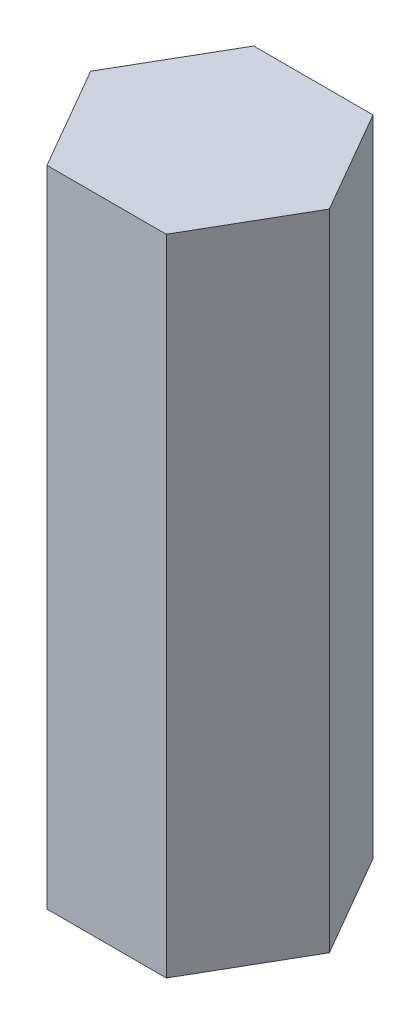
ISO-10303-21;
HEADER;
FILE_DESCRIPTION(('STEP AP214'),'2;1');
FILE_NAME('part.step','',(''),(''),'','','');
FILE_SCHEMA(('AUTOMOTIVE_DESIGN { 1 0 10303 214 1 1 1 1 }'));
ENDSEC;
DATA;
#1=APPLICATION_CONTEXT('core data for automotive mechanical design processes');
#2=APPLICATION_PROTOCOL_DEFINITION('international standard','automotive_design',2000,#1);
#3=PRODUCT_CONTEXT('',#1,'mechanical');
#4=PRODUCT('Part','Part','',(#3));
#5=PRODUCT_RELATED_PRODUCT_CATEGORY('part','',(#4));
#6=PRODUCT_DEFINITION_FORMATION('','',#4);
#7=PRODUCT_DEFINITION_CONTEXT('part definition',#1,'design');
#8=PRODUCT_DEFINITION('design','',#6,#7);
#9=PRODUCT_DEFINITION_SHAPE('','',#8);
#10=(LENGTH_UNIT() NAMED_UNIT(*) SI_UNIT(.MILLI.,.METRE.));
#11=(NAMED_UNIT(*) PLANE_ANGLE_UNIT() SI_UNIT($,.RADIAN.));
#12=(NAMED_UNIT(*) SI_UNIT($,.STERADIAN.) SOLID_ANGLE_UNIT());
#13=UNCERTAINTY_MEASURE_WITH_UNIT(LENGTH_MEASURE(1.E-05),#10,'distance_accuracy_value','');
#14=(GEOMETRIC_REPRESENTATION_CONTEXT(3) GLOBAL_UNCERTAINTY_ASSIGNED_CONTEXT((#13)) GLOBAL_UNIT_ASSIGNED_CONTEXT((#10,
#11,#12)) REPRESENTATION_CONTEXT('',''));
#15=CARTESIAN_POINT('',(0.,0.,0.));
#16=DIRECTION('',(0.,0.,1.));
#17=DIRECTION('',(1.,0.,0.));
#18=AXIS2_PLACEMENT_3D('',#15,#16,#17);
#19=CARTESIAN_POINT('',(1.5,16.19,2.59807621135332));
#20=DIRECTION('',(-0.866025403784439,0.,-0.5));
#21=DIRECTION('',(-0.5,0.,0.866025403784439));
#22=AXIS2_PLACEMENT_3D('',#19,#20,#21);
#23=PLANE('',#22);
#24=DIRECTION('',(0.5,0.,-0.866025403784439));
#25=VECTOR('',#24,1.);
#26=CARTESIAN_POINT('',(1.5,0.,2.59807621135332));
#27=LINE('',#26,#25);
#28=CARTESIAN_POINT('',(1.5,0.,2.59807621135332));
#29=VERTEX_POINT('',#28);
#30=CARTESIAN_POINT('',(3.,0.,0.));
#31=VERTEX_POINT('',#30);
#32=EDGE_CURVE('E116',#29,#31,#27,.T.);
#33=ORIENTED_EDGE('',*,*,#32,.T.);
#34=DIRECTION('',(0.,-1.,0.));
#35=VECTOR('',#34,1.);
#36=CARTESIAN_POINT('',(3.,16.19,0.));
#37=LINE('',#36,#35);
#38=CARTESIAN_POINT('',(3.,16.19,0.));
#39=VERTEX_POINT('',#38);
#40=EDGE_CURVE('E11',#39,#31,#37,.T.);
#41=ORIENTED_EDGE('',*,*,#40,.F.);
#42=DIRECTION('',(0.5,0.,-0.866025403784439));
#43=VECTOR('',#42,1.);
#44=CARTESIAN_POINT('',(1.5,16.19,2.59807621135332));
#45=LINE('',#44,#43);
#46=CARTESIAN_POINT('',(1.5,16.19,2.59807621135332));
#47=VERTEX_POINT('',#46);
#48=EDGE_CURVE('E127',#47,#39,#45,.T.);
#49=ORIENTED_EDGE('',*,*,#48,.F.);
#50=DIRECTION('',(0.,-1.,0.));
#51=VECTOR('',#50,1.);
#52=CARTESIAN_POINT('',(1.5,16.19,2.59807621135332));
#53=LINE('',#52,#51);
#54=EDGE_CURVE('E112',#47,#29,#53,.T.);
#55=ORIENTED_EDGE('',*,*,#54,.T.);
#56=EDGE_LOOP('',(#33,#41,#49,#55));
#57=FACE_BOUND('',#56,.T.);
#58=ADVANCED_FACE('F32',(#57),#23,.F.);
#59=CARTESIAN_POINT('',(3.,16.19,0.));
#60=DIRECTION('',(-0.866025403784439,0.,0.5));
#61=DIRECTION('',(0.5,0.,0.866025403784439));
#62=AXIS2_PLACEMENT_3D('',#59,#60,#61);
#63=PLANE('',#62);
#64=DIRECTION('',(-0.5,0.,-0.866025403784439));
#65=VECTOR('',#64,1.);
#66=CARTESIAN_POINT('',(3.,0.,0.));
#67=LINE('',#66,#65);
#68=CARTESIAN_POINT('',(1.5,0.,-2.59807621135332));
#69=VERTEX_POINT('',#68);
#70=EDGE_CURVE('E119',#31,#69,#67,.T.);
#71=ORIENTED_EDGE('',*,*,#70,.T.);
#72=DIRECTION('',(0.,-1.,0.));
#73=VECTOR('',#72,1.);
#74=CARTESIAN_POINT('',(1.5,16.19,-2.59807621135332));
#75=LINE('',#74,#73);
#76=CARTESIAN_POINT('',(1.5,16.19,-2.59807621135332));
#77=VERTEX_POINT('',#76);
#78=EDGE_CURVE('E40',#77,#69,#75,.T.);
#79=ORIENTED_EDGE('',*,*,#78,.F.);
#80=DIRECTION('',(-0.5,0.,-0.866025403784439));
#81=VECTOR('',#80,1.);
#82=CARTESIAN_POINT('',(3.,16.19,0.));
#83=LINE('',#82,#81);
#84=EDGE_CURVE('E85',#39,#77,#83,.T.);
#85=ORIENTED_EDGE('',*,*,#84,.F.);
#86=ORIENTED_EDGE('',*,*,#40,.T.);
#87=EDGE_LOOP('',(#71,#79,#85,#86));
#88=FACE_BOUND('',#87,.T.);
#89=ADVANCED_FACE('F151',(#88),#63,.F.);
#90=CARTESIAN_POINT('',(1.5,16.19,-2.59807621135332));
#91=DIRECTION('',(0.,0.,1.));
#92=DIRECTION('',(1.,0.,0.));
#93=AXIS2_PLACEMENT_3D('',#90,#91,#92);
#94=PLANE('',#93);
#95=DIRECTION('',(-1.,0.,0.));
#96=VECTOR('',#95,1.);
#97=CARTESIAN_POINT('',(1.5,0.,-2.59807621135332));
#98=LINE('',#97,#96);
#99=CARTESIAN_POINT('',(-1.5,0.,-2.59807621135332));
#100=VERTEX_POINT('',#99);
#101=EDGE_CURVE('E122',#69,#100,#98,.T.);
#102=ORIENTED_EDGE('',*,*,#101,.T.);
#103=DIRECTION('',(0.,-1.,0.));
#104=VECTOR('',#103,1.);
#105=CARTESIAN_POINT('',(-1.5,16.19,-2.59807621135332));
#106=LINE('',#105,#104);
#107=CARTESIAN_POINT('',(-1.5,16.19,-2.59807621135332));
#108=VERTEX_POINT('',#107);
#109=EDGE_CURVE('E107',#108,#100,#106,.T.);
#110=ORIENTED_EDGE('',*,*,#109,.F.);
#111=DIRECTION('',(-1.,0.,0.));
#112=VECTOR('',#111,1.);
#113=CARTESIAN_POINT('',(1.5,16.19,-2.59807621135332));
#114=LINE('',#113,#112);
#115=EDGE_CURVE('E98',#77,#108,#114,.T.);
#116=ORIENTED_EDGE('',*,*,#115,.F.);
#117=ORIENTED_EDGE('',*,*,#78,.T.);
#118=EDGE_LOOP('',(#102,#110,#116,#117));
#119=FACE_BOUND('',#118,.T.);
#120=ADVANCED_FACE('F133',(#119),#94,.F.);
#121=CARTESIAN_POINT('',(-1.5,16.19,-2.59807621135332));
#122=DIRECTION('',(0.866025403784439,0.,0.5));
#123=DIRECTION('',(0.5,0.,-0.866025403784439));
#124=AXIS2_PLACEMENT_3D('',#121,#122,#123);
#125=PLANE('',#124);
#126=DIRECTION('',(-0.5,0.,0.866025403784439));
#127=VECTOR('',#126,1.);
#128=CARTESIAN_POINT('',(-1.5,0.,-2.59807621135332));
#129=LINE('',#128,#127);
#130=CARTESIAN_POINT('',(-3.,0.,0.));
#131=VERTEX_POINT('',#130);
#132=EDGE_CURVE('E106',#100,#131,#129,.T.);
#133=ORIENTED_EDGE('',*,*,#132,.T.);
#134=DIRECTION('',(0.,-1.,0.));
#135=VECTOR('',#134,1.);
#136=CARTESIAN_POINT('',(-3.,16.19,0.));
#137=LINE('',#136,#135);
#138=CARTESIAN_POINT('',(-3.,16.19,0.));
#139=VERTEX_POINT('',#138);
#140=EDGE_CURVE('E103',#139,#131,#137,.T.);
#141=ORIENTED_EDGE('',*,*,#140,.F.);
#142=DIRECTION('',(-0.5,0.,0.866025403784439));
#143=VECTOR('',#142,1.);
#144=CARTESIAN_POINT('',(-1.5,16.19,-2.59807621135332));
#145=LINE('',#144,#143);
#146=EDGE_CURVE('E92',#108,#139,#145,.T.);
#147=ORIENTED_EDGE('',*,*,#146,.F.);
#148=ORIENTED_EDGE('',*,*,#109,.T.);
#149=EDGE_LOOP('',(#133,#141,#147,#148));
#150=FACE_BOUND('',#149,.T.);
#151=ADVANCED_FACE('F104',(#150),#125,.F.);
#152=CARTESIAN_POINT('',(-3.,16.19,0.));
#153=DIRECTION('',(0.866025403784439,0.,-0.5));
#154=DIRECTION('',(-0.5,0.,-0.866025403784439));
#155=AXIS2_PLACEMENT_3D('',#152,#153,#154);
#156=PLANE('',#155);
#157=DIRECTION('',(0.5,0.,0.866025403784439));
#158=VECTOR('',#157,1.);
#159=CARTESIAN_POINT('',(-3.,0.,0.));
#160=LINE('',#159,#158);
#161=CARTESIAN_POINT('',(-1.5,0.,2.59807621135332));
#162=VERTEX_POINT('',#161);
#163=EDGE_CURVE('E71',#131,#162,#160,.T.);
#164=ORIENTED_EDGE('',*,*,#163,.T.);
#165=DIRECTION('',(0.,-1.,0.));
#166=VECTOR('',#165,1.);
#167=CARTESIAN_POINT('',(-1.5,16.19,2.59807621135332));
#168=LINE('',#167,#166);
#169=CARTESIAN_POINT('',(-1.5,16.19,2.59807621135332));
#170=VERTEX_POINT('',#169);
#171=EDGE_CURVE('E108',#170,#162,#168,.T.);
#172=ORIENTED_EDGE('',*,*,#171,.F.);
#173=DIRECTION('',(0.5,0.,0.866025403784439));
#174=VECTOR('',#173,1.);
#175=CARTESIAN_POINT('',(-3.,16.19,0.));
#176=LINE('',#175,#174);
#177=EDGE_CURVE('E96',#139,#170,#176,.T.);
#178=ORIENTED_EDGE('',*,*,#177,.F.);
#179=ORIENTED_EDGE('',*,*,#140,.T.);
#180=EDGE_LOOP('',(#164,#172,#178,#179));
#181=FACE_BOUND('',#180,.T.);
#182=ADVANCED_FACE('F110',(#181),#156,.F.);
#183=CARTESIAN_POINT('',(-1.5,16.19,2.59807621135332));
#184=DIRECTION('',(0.,0.,-1.));
#185=DIRECTION('',(-1.,0.,0.));
#186=AXIS2_PLACEMENT_3D('',#183,#184,#185);
#187=PLANE('',#186);
#188=DIRECTION('',(1.,0.,0.));
#189=VECTOR('',#188,1.);
#190=CARTESIAN_POINT('',(-1.5,0.,2.59807621135332));
#191=LINE('',#190,#189);
#192=EDGE_CURVE('E77',#162,#29,#191,.T.);
#193=ORIENTED_EDGE('',*,*,#192,.T.);
#194=ORIENTED_EDGE('',*,*,#54,.F.);
#195=DIRECTION('',(1.,0.,0.));
#196=VECTOR('',#195,1.);
#197=CARTESIAN_POINT('',(-1.5,16.19,2.59807621135332));
#198=LINE('',#197,#196);
#199=EDGE_CURVE('E48',#170,#47,#198,.T.);
#200=ORIENTED_EDGE('',*,*,#199,.F.);
#201=ORIENTED_EDGE('',*,*,#171,.T.);
#202=EDGE_LOOP('',(#193,#194,#200,#201));
#203=FACE_BOUND('',#202,.T.);
#204=ADVANCED_FACE('F140',(#203),#187,.F.);
#205=CARTESIAN_POINT('',(0.,16.19,0.));
#206=DIRECTION('',(0.,1.,0.));
#207=DIRECTION('',(0.,0.,1.));
#208=AXIS2_PLACEMENT_3D('',#205,#206,#207);
#209=PLANE('',#208);
#210=ORIENTED_EDGE('',*,*,#48,.T.);
#211=ORIENTED_EDGE('',*,*,#84,.T.);
#212=ORIENTED_EDGE('',*,*,#115,.T.);
#213=ORIENTED_EDGE('',*,*,#146,.T.);
#214=ORIENTED_EDGE('',*,*,#177,.T.);
#215=ORIENTED_EDGE('',*,*,#199,.T.);
#216=EDGE_LOOP('',(#210,#211,#212,#213,#214,#215));
#217=FACE_BOUND('',#216,.T.);
#218=ADVANCED_FACE('F94',(#217),#209,.T.);
#219=CARTESIAN_POINT('',(0.,0.,0.));
#220=DIRECTION('',(0.,1.,0.));
#221=DIRECTION('',(0.,0.,1.));
#222=AXIS2_PLACEMENT_3D('',#219,#220,#221);
#223=PLANE('',#222);
#224=CARTESIAN_POINT('',(0.,0.,0.));
#225=DIRECTION('',(0.,-1.,0.));
#226=DIRECTION('',(0.,0.,-1.));
#227=AXIS2_PLACEMENT_3D('',#224,#225,#226);
#228=CIRCLE('',#227,1.6);
#229=CARTESIAN_POINT('',(0.,0.,-1.6));
#230=VERTEX_POINT('',#229);
#231=EDGE_CURVE('E213',#230,#230,#228,.T.);
#232=ORIENTED_EDGE('',*,*,#231,.F.);
#233=EDGE_LOOP('',(#232));
#234=FACE_BOUND('',#233,.T.);
#235=ORIENTED_EDGE('',*,*,#32,.F.);
#236=ORIENTED_EDGE('',*,*,#192,.F.);
#237=ORIENTED_EDGE('',*,*,#163,.F.);
#238=ORIENTED_EDGE('',*,*,#132,.F.);
#239=ORIENTED_EDGE('',*,*,#101,.F.);
#240=ORIENTED_EDGE('',*,*,#70,.F.);
#241=EDGE_LOOP('',(#235,#236,#237,#238,#239,#240));
#242=FACE_BOUND('',#241,.T.);
#243=ADVANCED_FACE('F136',(#234,#242),#223,.F.);
#244=CARTESIAN_POINT('',(0.,5.,0.));
#245=DIRECTION('',(0.,-1.,0.));
#246=DIRECTION('',(0.,0.,-1.));
#247=AXIS2_PLACEMENT_3D('',#244,#245,#246);
#248=CYLINDRICAL_SURFACE('',#247,1.6);
#249=CARTESIAN_POINT('',(0.,5.,0.));
#250=DIRECTION('',(0.,-1.,0.));
#251=DIRECTION('',(0.,0.,-1.));
#252=AXIS2_PLACEMENT_3D('',#249,#250,#251);
#253=CIRCLE('',#252,1.6);
#254=CARTESIAN_POINT('',(0.,5.,-1.6));
#255=VERTEX_POINT('',#254);
#256=EDGE_CURVE('E120',#255,#255,#253,.T.);
#257=ORIENTED_EDGE('',*,*,#256,.F.);
#258=EDGE_LOOP('',(#257));
#259=FACE_BOUND('',#258,.T.);
#260=ORIENTED_EDGE('',*,*,#231,.T.);
#261=EDGE_LOOP('',(#260));
#262=FACE_BOUND('',#261,.T.);
#263=ADVANCED_FACE('F188',(#259,#262),#248,.F.);
#264=CARTESIAN_POINT('',(0.,5.,0.));
#265=DIRECTION('',(0.,-1.,0.));
#266=DIRECTION('',(0.,0.,-1.));
#267=AXIS2_PLACEMENT_3D('',#264,#265,#266);
#268=PLANE('',#267);
#269=ORIENTED_EDGE('',*,*,#256,.T.);
#270=EDGE_LOOP('',(#269));
#271=FACE_BOUND('',#270,.T.);
#272=ADVANCED_FACE('F197',(#271),#268,.T.);
#273=CLOSED_SHELL('',(#58,#89,#120,#151,#182,#204,#218,#243,#263,#272));
#274=MANIFOLD_SOLID_BREP('B2',#273);
#275=ADVANCED_BREP_SHAPE_REPRESENTATION('',(#18,#274),#14);
#276=SHAPE_DEFINITION_REPRESENTATION(#9,#275);
ENDSEC;
END-ISO-10303-21;
